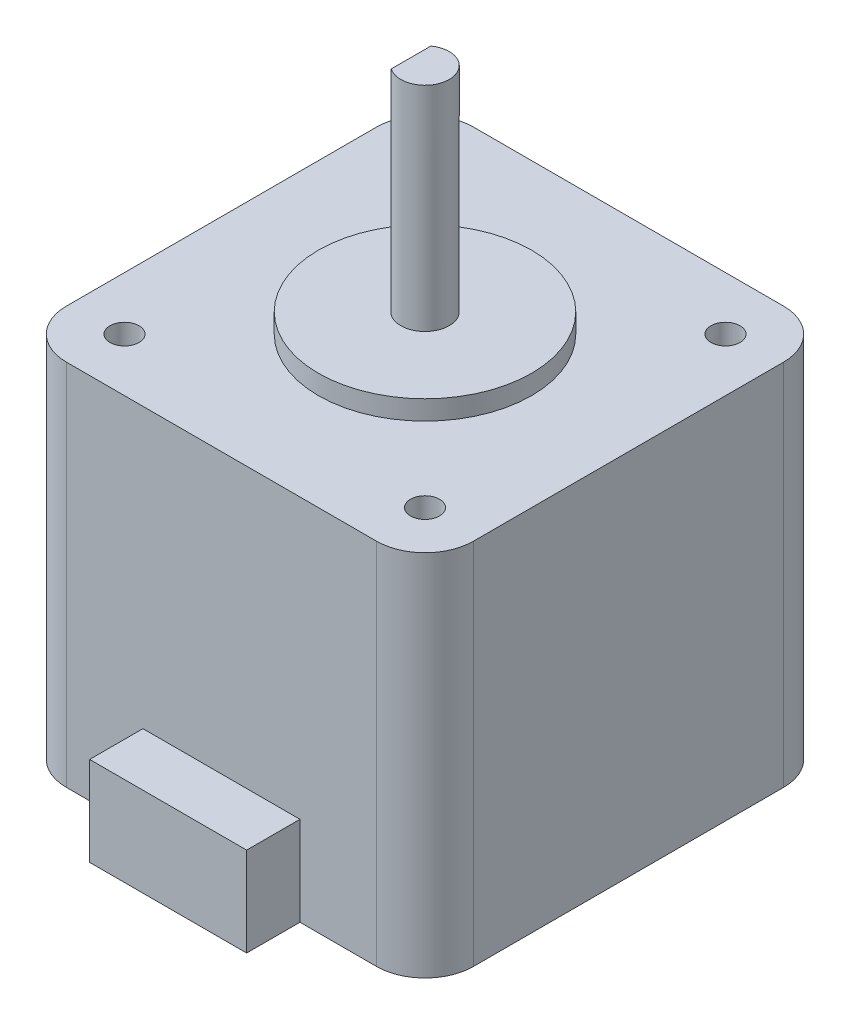
ISO-10303-21;
HEADER;
FILE_DESCRIPTION(('STEP AP214'),'2;1');
FILE_NAME('part.step','',(''),(''),'','','');
FILE_SCHEMA(('AUTOMOTIVE_DESIGN { 1 0 10303 214 1 1 1 1 }'));
ENDSEC;
DATA;
#1=APPLICATION_CONTEXT('core data for automotive mechanical design processes');
#2=APPLICATION_PROTOCOL_DEFINITION('international standard','automotive_design',2000,#1);
#3=PRODUCT_CONTEXT('',#1,'mechanical');
#4=PRODUCT('Part','Part','',(#3));
#5=PRODUCT_RELATED_PRODUCT_CATEGORY('part','',(#4));
#6=PRODUCT_DEFINITION_FORMATION('','',#4);
#7=PRODUCT_DEFINITION_CONTEXT('part definition',#1,'design');
#8=PRODUCT_DEFINITION('design','',#6,#7);
#9=PRODUCT_DEFINITION_SHAPE('','',#8);
#10=(LENGTH_UNIT() NAMED_UNIT(*) SI_UNIT(.MILLI.,.METRE.));
#11=(NAMED_UNIT(*) PLANE_ANGLE_UNIT() SI_UNIT($,.RADIAN.));
#12=(NAMED_UNIT(*) SI_UNIT($,.STERADIAN.) SOLID_ANGLE_UNIT());
#13=UNCERTAINTY_MEASURE_WITH_UNIT(LENGTH_MEASURE(1.E-05),#10,'distance_accuracy_value','');
#14=(GEOMETRIC_REPRESENTATION_CONTEXT(3) GLOBAL_UNCERTAINTY_ASSIGNED_CONTEXT((#13)) GLOBAL_UNIT_ASSIGNED_CONTEXT((#10,
#11,#12)) REPRESENTATION_CONTEXT('',''));
#15=CARTESIAN_POINT('',(0.,0.,0.));
#16=DIRECTION('',(0.,0.,1.));
#17=DIRECTION('',(1.,0.,0.));
#18=AXIS2_PLACEMENT_3D('',#15,#16,#17);
#19=CARTESIAN_POINT('',(0.,62.,0.));
#20=DIRECTION('',(0.,-1.,0.));
#21=DIRECTION('',(0.,0.,-1.));
#22=AXIS2_PLACEMENT_3D('',#19,#20,#21);
#23=CYLINDRICAL_SURFACE('',#22,2.5);
#24=CARTESIAN_POINT('',(0.,40.,0.));
#25=DIRECTION('',(0.,1.,0.));
#26=DIRECTION('',(0.,0.,1.));
#27=AXIS2_PLACEMENT_3D('',#24,#25,#26);
#28=CIRCLE('',#27,2.5);
#29=CARTESIAN_POINT('',(0.,40.,2.5));
#30=VERTEX_POINT('',#29);
#31=EDGE_CURVE('E249',#30,#30,#28,.T.);
#32=ORIENTED_EDGE('',*,*,#31,.T.);
#33=EDGE_LOOP('',(#32));
#34=FACE_BOUND('',#33,.T.);
#35=DIRECTION('',(0.,1.,0.));
#36=VECTOR('',#35,1.);
#37=CARTESIAN_POINT('',(-1.4382470003859,42.,-2.04485832415866));
#38=LINE('',#37,#36);
#39=CARTESIAN_POINT('',(-1.4382470003859,42.,-2.04485832415866));
#40=VERTEX_POINT('',#39);
#41=CARTESIAN_POINT('',(-1.4382470003859,62.,-2.04485832415866));
#42=VERTEX_POINT('',#41);
#43=EDGE_CURVE('E140',#40,#42,#38,.T.);
#44=ORIENTED_EDGE('',*,*,#43,.T.);
#45=CARTESIAN_POINT('',(0.,62.,0.));
#46=DIRECTION('',(0.,1.,0.));
#47=DIRECTION('',(0.,0.,1.));
#48=AXIS2_PLACEMENT_3D('',#45,#46,#47);
#49=CIRCLE('',#48,2.5);
#50=CARTESIAN_POINT('',(-1.4382470003859,62.,2.04485832415866));
#51=VERTEX_POINT('',#50);
#52=EDGE_CURVE('E245',#51,#42,#49,.T.);
#53=ORIENTED_EDGE('',*,*,#52,.F.);
#54=DIRECTION('',(0.,1.,0.));
#55=VECTOR('',#54,1.);
#56=CARTESIAN_POINT('',(-1.4382470003859,42.,2.04485832415866));
#57=LINE('',#56,#55);
#58=CARTESIAN_POINT('',(-1.4382470003859,42.,2.04485832415866));
#59=VERTEX_POINT('',#58);
#60=EDGE_CURVE('E56',#59,#51,#57,.T.);
#61=ORIENTED_EDGE('',*,*,#60,.F.);
#62=CARTESIAN_POINT('',(0.,42.,0.));
#63=DIRECTION('',(0.,1.,0.));
#64=DIRECTION('',(0.,0.,1.));
#65=AXIS2_PLACEMENT_3D('',#62,#63,#64);
#66=CIRCLE('',#65,2.5);
#67=EDGE_CURVE('E151',#40,#59,#66,.T.);
#68=ORIENTED_EDGE('',*,*,#67,.F.);
#69=EDGE_LOOP('',(#44,#53,#61,#68));
#70=FACE_BOUND('',#69,.T.);
#71=ADVANCED_FACE('F40',(#34,#70),#23,.T.);
#72=CARTESIAN_POINT('',(0.,62.,0.));
#73=DIRECTION('',(0.,1.,0.));
#74=DIRECTION('',(0.,0.,1.));
#75=AXIS2_PLACEMENT_3D('',#72,#73,#74);
#76=PLANE('',#75);
#77=ORIENTED_EDGE('',*,*,#52,.T.);
#78=DIRECTION('',(0.,0.,1.));
#79=VECTOR('',#78,1.);
#80=CARTESIAN_POINT('',(-1.4382470003859,62.,0.));
#81=LINE('',#80,#79);
#82=EDGE_CURVE('E145',#42,#51,#81,.T.);
#83=ORIENTED_EDGE('',*,*,#82,.T.);
#84=EDGE_LOOP('',(#77,#83));
#85=FACE_BOUND('',#84,.T.);
#86=ADVANCED_FACE('F398',(#85),#76,.T.);
#87=CARTESIAN_POINT('',(-21.,38.,21.));
#88=DIRECTION('',(0.,0.,-1.));
#89=DIRECTION('',(-1.,0.,0.));
#90=AXIS2_PLACEMENT_3D('',#87,#88,#89);
#91=PLANE('',#90);
#92=DIRECTION('',(1.,0.,0.));
#93=VECTOR('',#92,1.);
#94=CARTESIAN_POINT('',(-21.,0.,21.));
#95=LINE('',#94,#93);
#96=CARTESIAN_POINT('',(8.1,0.,21.));
#97=VERTEX_POINT('',#96);
#98=CARTESIAN_POINT('',(16.,0.,21.));
#99=VERTEX_POINT('',#98);
#100=EDGE_CURVE('E289',#97,#99,#95,.T.);
#101=ORIENTED_EDGE('',*,*,#100,.T.);
#102=DIRECTION('',(0.,-1.,0.));
#103=VECTOR('',#102,1.);
#104=CARTESIAN_POINT('',(16.,38.,21.));
#105=LINE('',#104,#103);
#106=CARTESIAN_POINT('',(16.,38.,21.));
#107=VERTEX_POINT('',#106);
#108=EDGE_CURVE('E11',#99,#107,#105,.F.);
#109=ORIENTED_EDGE('',*,*,#108,.T.);
#110=DIRECTION('',(1.,0.,0.));
#111=VECTOR('',#110,1.);
#112=CARTESIAN_POINT('',(-21.,38.,21.));
#113=LINE('',#112,#111);
#114=CARTESIAN_POINT('',(-16.,38.,21.));
#115=VERTEX_POINT('',#114);
#116=EDGE_CURVE('E262',#115,#107,#113,.T.);
#117=ORIENTED_EDGE('',*,*,#116,.F.);
#118=DIRECTION('',(0.,-1.,0.));
#119=VECTOR('',#118,1.);
#120=CARTESIAN_POINT('',(-16.,38.,21.));
#121=LINE('',#120,#119);
#122=CARTESIAN_POINT('',(-16.,0.,21.));
#123=VERTEX_POINT('',#122);
#124=EDGE_CURVE('E49',#115,#123,#121,.T.);
#125=ORIENTED_EDGE('',*,*,#124,.T.);
#126=CARTESIAN_POINT('',(-8.1,0.,21.));
#127=VERTEX_POINT('',#126);
#128=EDGE_CURVE('E268',#123,#127,#95,.T.);
#129=ORIENTED_EDGE('',*,*,#128,.T.);
#130=DIRECTION('',(0.,-1.,0.));
#131=VECTOR('',#130,1.);
#132=CARTESIAN_POINT('',(-8.1,9.2,21.));
#133=LINE('',#132,#131);
#134=CARTESIAN_POINT('',(-8.1,9.2,21.));
#135=VERTEX_POINT('',#134);
#136=EDGE_CURVE('E210',#135,#127,#133,.T.);
#137=ORIENTED_EDGE('',*,*,#136,.F.);
#138=DIRECTION('',(-1.,0.,0.));
#139=VECTOR('',#138,1.);
#140=CARTESIAN_POINT('',(-8.1,9.2,21.));
#141=LINE('',#140,#139);
#142=CARTESIAN_POINT('',(8.1,9.2,21.));
#143=VERTEX_POINT('',#142);
#144=EDGE_CURVE('E223',#143,#135,#141,.T.);
#145=ORIENTED_EDGE('',*,*,#144,.F.);
#146=DIRECTION('',(0.,1.,0.));
#147=VECTOR('',#146,1.);
#148=CARTESIAN_POINT('',(8.1,9.2,21.));
#149=LINE('',#148,#147);
#150=EDGE_CURVE('E201',#97,#143,#149,.T.);
#151=ORIENTED_EDGE('',*,*,#150,.F.);
#152=EDGE_LOOP('',(#101,#109,#117,#125,#129,#137,#145,#151));
#153=FACE_BOUND('',#152,.T.);
#154=ADVANCED_FACE('F339',(#153),#91,.F.);
#155=CARTESIAN_POINT('',(21.,38.,-21.));
#156=DIRECTION('',(-1.,0.,0.));
#157=DIRECTION('',(0.,0.,1.));
#158=AXIS2_PLACEMENT_3D('',#155,#156,#157);
#159=PLANE('',#158);
#160=DIRECTION('',(0.,0.,-1.));
#161=VECTOR('',#160,1.);
#162=CARTESIAN_POINT('',(21.,0.,-21.));
#163=LINE('',#162,#161);
#164=CARTESIAN_POINT('',(21.,0.,16.));
#165=VERTEX_POINT('',#164);
#166=CARTESIAN_POINT('',(21.,0.,-16.));
#167=VERTEX_POINT('',#166);
#168=EDGE_CURVE('E258',#165,#167,#163,.T.);
#169=ORIENTED_EDGE('',*,*,#168,.T.);
#170=DIRECTION('',(0.,-1.,0.));
#171=VECTOR('',#170,1.);
#172=CARTESIAN_POINT('',(21.,38.,-16.));
#173=LINE('',#172,#171);
#174=CARTESIAN_POINT('',(21.,38.,-16.));
#175=VERTEX_POINT('',#174);
#176=EDGE_CURVE('E314',#167,#175,#173,.F.);
#177=ORIENTED_EDGE('',*,*,#176,.T.);
#178=DIRECTION('',(0.,0.,-1.));
#179=VECTOR('',#178,1.);
#180=CARTESIAN_POINT('',(21.,38.,-21.));
#181=LINE('',#180,#179);
#182=CARTESIAN_POINT('',(21.,38.,16.));
#183=VERTEX_POINT('',#182);
#184=EDGE_CURVE('E263',#183,#175,#181,.T.);
#185=ORIENTED_EDGE('',*,*,#184,.F.);
#186=DIRECTION('',(0.,-1.,0.));
#187=VECTOR('',#186,1.);
#188=CARTESIAN_POINT('',(21.,38.,16.));
#189=LINE('',#188,#187);
#190=EDGE_CURVE('E310',#183,#165,#189,.T.);
#191=ORIENTED_EDGE('',*,*,#190,.T.);
#192=EDGE_LOOP('',(#169,#177,#185,#191));
#193=FACE_BOUND('',#192,.T.);
#194=ADVANCED_FACE('F368',(#193),#159,.F.);
#195=CARTESIAN_POINT('',(-21.,38.,-21.));
#196=DIRECTION('',(0.,0.,1.));
#197=DIRECTION('',(1.,0.,0.));
#198=AXIS2_PLACEMENT_3D('',#195,#196,#197);
#199=PLANE('',#198);
#200=DIRECTION('',(-1.,0.,0.));
#201=VECTOR('',#200,1.);
#202=CARTESIAN_POINT('',(-21.,38.,-21.));
#203=LINE('',#202,#201);
#204=CARTESIAN_POINT('',(16.,38.,-21.));
#205=VERTEX_POINT('',#204);
#206=CARTESIAN_POINT('',(-16.,38.,-21.));
#207=VERTEX_POINT('',#206);
#208=EDGE_CURVE('E267',#205,#207,#203,.T.);
#209=ORIENTED_EDGE('',*,*,#208,.F.);
#210=DIRECTION('',(0.,-1.,0.));
#211=VECTOR('',#210,1.);
#212=CARTESIAN_POINT('',(16.,38.,-21.));
#213=LINE('',#212,#211);
#214=CARTESIAN_POINT('',(16.,0.,-21.));
#215=VERTEX_POINT('',#214);
#216=EDGE_CURVE('E294',#205,#215,#213,.T.);
#217=ORIENTED_EDGE('',*,*,#216,.T.);
#218=DIRECTION('',(-1.,0.,0.));
#219=VECTOR('',#218,1.);
#220=CARTESIAN_POINT('',(-21.,0.,-21.));
#221=LINE('',#220,#219);
#222=CARTESIAN_POINT('',(-16.,0.,-21.));
#223=VERTEX_POINT('',#222);
#224=EDGE_CURVE('E281',#215,#223,#221,.T.);
#225=ORIENTED_EDGE('',*,*,#224,.T.);
#226=DIRECTION('',(0.,-1.,0.));
#227=VECTOR('',#226,1.);
#228=CARTESIAN_POINT('',(-16.,38.,-21.));
#229=LINE('',#228,#227);
#230=EDGE_CURVE('E253',#223,#207,#229,.F.);
#231=ORIENTED_EDGE('',*,*,#230,.T.);
#232=EDGE_LOOP('',(#209,#217,#225,#231));
#233=FACE_BOUND('',#232,.T.);
#234=ADVANCED_FACE('F378',(#233),#199,.F.);
#235=CARTESIAN_POINT('',(-21.,38.,-21.));
#236=DIRECTION('',(1.,0.,0.));
#237=DIRECTION('',(0.,0.,-1.));
#238=AXIS2_PLACEMENT_3D('',#235,#236,#237);
#239=PLANE('',#238);
#240=DIRECTION('',(0.,0.,1.));
#241=VECTOR('',#240,1.);
#242=CARTESIAN_POINT('',(-21.,38.,-21.));
#243=LINE('',#242,#241);
#244=CARTESIAN_POINT('',(-21.,38.,-16.));
#245=VERTEX_POINT('',#244);
#246=CARTESIAN_POINT('',(-21.,38.,16.));
#247=VERTEX_POINT('',#246);
#248=EDGE_CURVE('E272',#245,#247,#243,.T.);
#249=ORIENTED_EDGE('',*,*,#248,.F.);
#250=DIRECTION('',(0.,-1.,0.));
#251=VECTOR('',#250,1.);
#252=CARTESIAN_POINT('',(-21.,38.,-16.));
#253=LINE('',#252,#251);
#254=CARTESIAN_POINT('',(-21.,0.,-16.));
#255=VERTEX_POINT('',#254);
#256=EDGE_CURVE('E332',#245,#255,#253,.T.);
#257=ORIENTED_EDGE('',*,*,#256,.T.);
#258=DIRECTION('',(0.,0.,1.));
#259=VECTOR('',#258,1.);
#260=CARTESIAN_POINT('',(-21.,0.,-21.));
#261=LINE('',#260,#259);
#262=CARTESIAN_POINT('',(-21.,0.,16.));
#263=VERTEX_POINT('',#262);
#264=EDGE_CURVE('E285',#255,#263,#261,.T.);
#265=ORIENTED_EDGE('',*,*,#264,.T.);
#266=DIRECTION('',(0.,-1.,0.));
#267=VECTOR('',#266,1.);
#268=CARTESIAN_POINT('',(-21.,38.,16.));
#269=LINE('',#268,#267);
#270=EDGE_CURVE('E329',#263,#247,#269,.F.);
#271=ORIENTED_EDGE('',*,*,#270,.T.);
#272=EDGE_LOOP('',(#249,#257,#265,#271));
#273=FACE_BOUND('',#272,.T.);
#274=ADVANCED_FACE('F386',(#273),#239,.F.);
#275=CARTESIAN_POINT('',(0.,38.,0.));
#276=DIRECTION('',(0.,1.,0.));
#277=DIRECTION('',(0.,0.,1.));
#278=AXIS2_PLACEMENT_3D('',#275,#276,#277);
#279=PLANE('',#278);
#280=CARTESIAN_POINT('',(-15.4999999999991,38.,15.5));
#281=DIRECTION('',(0.,1.,0.));
#282=DIRECTION('',(0.,0.,1.));
#283=AXIS2_PLACEMENT_3D('',#280,#281,#282);
#284=CIRCLE('',#283,1.50000000000046);
#285=CARTESIAN_POINT('',(-15.4999999999991,38.,17.0000000000005));
#286=VERTEX_POINT('',#285);
#287=EDGE_CURVE('E169',#286,#286,#284,.T.);
#288=ORIENTED_EDGE('',*,*,#287,.F.);
#289=EDGE_LOOP('',(#288));
#290=FACE_BOUND('',#289,.T.);
#291=CARTESIAN_POINT('',(15.5000000000009,38.,15.4999999999991));
#292=DIRECTION('',(0.,1.,0.));
#293=DIRECTION('',(0.,0.,1.));
#294=AXIS2_PLACEMENT_3D('',#291,#292,#293);
#295=CIRCLE('',#294,1.50000000000121);
#296=CARTESIAN_POINT('',(15.5000000000009,38.,17.0000000000003));
#297=VERTEX_POINT('',#296);
#298=EDGE_CURVE('E186',#297,#297,#295,.T.);
#299=ORIENTED_EDGE('',*,*,#298,.F.);
#300=EDGE_LOOP('',(#299));
#301=FACE_BOUND('',#300,.T.);
#302=CARTESIAN_POINT('',(15.5,38.,-15.5000000000009));
#303=DIRECTION('',(0.,1.,0.));
#304=DIRECTION('',(0.,0.,1.));
#305=AXIS2_PLACEMENT_3D('',#302,#303,#304);
#306=CIRCLE('',#305,1.5000000000009);
#307=CARTESIAN_POINT('',(15.5,38.,-14.));
#308=VERTEX_POINT('',#307);
#309=EDGE_CURVE('E178',#308,#308,#306,.T.);
#310=ORIENTED_EDGE('',*,*,#309,.F.);
#311=EDGE_LOOP('',(#310));
#312=FACE_BOUND('',#311,.T.);
#313=CARTESIAN_POINT('',(-15.5,38.,-15.5));
#314=DIRECTION('',(0.,1.,0.));
#315=DIRECTION('',(0.,0.,1.));
#316=AXIS2_PLACEMENT_3D('',#313,#314,#315);
#317=CIRCLE('',#316,1.5);
#318=CARTESIAN_POINT('',(-15.5,38.,-14.));
#319=VERTEX_POINT('',#318);
#320=EDGE_CURVE('E177',#319,#319,#317,.T.);
#321=ORIENTED_EDGE('',*,*,#320,.F.);
#322=EDGE_LOOP('',(#321));
#323=FACE_BOUND('',#322,.T.);
#324=CARTESIAN_POINT('',(0.,38.,0.));
#325=DIRECTION('',(0.,1.,0.));
#326=DIRECTION('',(0.,0.,1.));
#327=AXIS2_PLACEMENT_3D('',#324,#325,#326);
#328=CIRCLE('',#327,11.);
#329=CARTESIAN_POINT('',(0.,38.,11.));
#330=VERTEX_POINT('',#329);
#331=EDGE_CURVE('E254',#330,#330,#328,.T.);
#332=ORIENTED_EDGE('',*,*,#331,.F.);
#333=EDGE_LOOP('',(#332));
#334=FACE_BOUND('',#333,.T.);
#335=ORIENTED_EDGE('',*,*,#184,.T.);
#336=CARTESIAN_POINT('',(16.,38.,-16.));
#337=DIRECTION('',(0.,1.,0.));
#338=DIRECTION('',(0.,0.,1.));
#339=AXIS2_PLACEMENT_3D('',#336,#337,#338);
#340=CIRCLE('',#339,5.);
#341=EDGE_CURVE('E326',#175,#205,#340,.T.);
#342=ORIENTED_EDGE('',*,*,#341,.T.);
#343=ORIENTED_EDGE('',*,*,#208,.T.);
#344=CARTESIAN_POINT('',(-16.,38.,-16.));
#345=DIRECTION('',(0.,1.,0.));
#346=DIRECTION('',(0.,0.,1.));
#347=AXIS2_PLACEMENT_3D('',#344,#345,#346);
#348=CIRCLE('',#347,5.);
#349=EDGE_CURVE('E323',#207,#245,#348,.T.);
#350=ORIENTED_EDGE('',*,*,#349,.T.);
#351=ORIENTED_EDGE('',*,*,#248,.T.);
#352=CARTESIAN_POINT('',(-16.,38.,16.));
#353=DIRECTION('',(0.,1.,0.));
#354=DIRECTION('',(0.,0.,1.));
#355=AXIS2_PLACEMENT_3D('',#352,#353,#354);
#356=CIRCLE('',#355,5.);
#357=EDGE_CURVE('E317',#247,#115,#356,.T.);
#358=ORIENTED_EDGE('',*,*,#357,.T.);
#359=ORIENTED_EDGE('',*,*,#116,.T.);
#360=CARTESIAN_POINT('',(16.,38.,16.));
#361=DIRECTION('',(0.,1.,0.));
#362=DIRECTION('',(0.,0.,1.));
#363=AXIS2_PLACEMENT_3D('',#360,#361,#362);
#364=CIRCLE('',#363,5.);
#365=EDGE_CURVE('E320',#107,#183,#364,.T.);
#366=ORIENTED_EDGE('',*,*,#365,.T.);
#367=EDGE_LOOP('',(#335,#342,#343,#350,#351,#358,#359,#366));
#368=FACE_BOUND('',#367,.T.);
#369=ADVANCED_FACE('F372',(#290,#301,#312,#323,#334,#368),#279,.T.);
#370=CARTESIAN_POINT('',(0.,0.,0.));
#371=DIRECTION('',(0.,1.,0.));
#372=DIRECTION('',(0.,0.,1.));
#373=AXIS2_PLACEMENT_3D('',#370,#371,#372);
#374=PLANE('',#373);
#375=CARTESIAN_POINT('',(0.,0.,0.));
#376=DIRECTION('',(0.,-1.,0.));
#377=DIRECTION('',(0.,0.,-1.));
#378=AXIS2_PLACEMENT_3D('',#375,#376,#377);
#379=CIRCLE('',#378,4.);
#380=CARTESIAN_POINT('',(0.,0.,-4.));
#381=VERTEX_POINT('',#380);
#382=EDGE_CURVE('E163',#381,#381,#379,.T.);
#383=ORIENTED_EDGE('',*,*,#382,.F.);
#384=EDGE_LOOP('',(#383));
#385=FACE_BOUND('',#384,.T.);
#386=ORIENTED_EDGE('',*,*,#224,.F.);
#387=CARTESIAN_POINT('',(16.,0.,-16.));
#388=DIRECTION('',(0.,1.,0.));
#389=DIRECTION('',(0.,0.,1.));
#390=AXIS2_PLACEMENT_3D('',#387,#388,#389);
#391=CIRCLE('',#390,5.);
#392=EDGE_CURVE('E307',#215,#167,#391,.F.);
#393=ORIENTED_EDGE('',*,*,#392,.T.);
#394=ORIENTED_EDGE('',*,*,#168,.F.);
#395=CARTESIAN_POINT('',(16.,0.,16.));
#396=DIRECTION('',(0.,1.,0.));
#397=DIRECTION('',(0.,0.,1.));
#398=AXIS2_PLACEMENT_3D('',#395,#396,#397);
#399=CIRCLE('',#398,5.);
#400=EDGE_CURVE('E301',#165,#99,#399,.F.);
#401=ORIENTED_EDGE('',*,*,#400,.T.);
#402=ORIENTED_EDGE('',*,*,#100,.F.);
#403=DIRECTION('',(0.,0.,-1.));
#404=VECTOR('',#403,1.);
#405=CARTESIAN_POINT('',(8.1,0.,26.5));
#406=LINE('',#405,#404);
#407=CARTESIAN_POINT('',(8.1,0.,26.5));
#408=VERTEX_POINT('',#407);
#409=EDGE_CURVE('E219',#408,#97,#406,.T.);
#410=ORIENTED_EDGE('',*,*,#409,.F.);
#411=DIRECTION('',(1.,0.,0.));
#412=VECTOR('',#411,1.);
#413=CARTESIAN_POINT('',(-8.1,0.,26.5));
#414=LINE('',#413,#412);
#415=CARTESIAN_POINT('',(-8.1,0.,26.5));
#416=VERTEX_POINT('',#415);
#417=EDGE_CURVE('E216',#416,#408,#414,.T.);
#418=ORIENTED_EDGE('',*,*,#417,.F.);
#419=DIRECTION('',(0.,0.,-1.));
#420=VECTOR('',#419,1.);
#421=CARTESIAN_POINT('',(-8.1,0.,26.5));
#422=LINE('',#421,#420);
#423=EDGE_CURVE('E233',#416,#127,#422,.T.);
#424=ORIENTED_EDGE('',*,*,#423,.T.);
#425=ORIENTED_EDGE('',*,*,#128,.F.);
#426=CARTESIAN_POINT('',(-16.,0.,16.));
#427=DIRECTION('',(0.,1.,0.));
#428=DIRECTION('',(0.,0.,1.));
#429=AXIS2_PLACEMENT_3D('',#426,#427,#428);
#430=CIRCLE('',#429,5.);
#431=EDGE_CURVE('E298',#123,#263,#430,.F.);
#432=ORIENTED_EDGE('',*,*,#431,.T.);
#433=ORIENTED_EDGE('',*,*,#264,.F.);
#434=CARTESIAN_POINT('',(-16.,0.,-16.));
#435=DIRECTION('',(0.,1.,0.));
#436=DIRECTION('',(0.,0.,1.));
#437=AXIS2_PLACEMENT_3D('',#434,#435,#436);
#438=CIRCLE('',#437,5.);
#439=EDGE_CURVE('E304',#255,#223,#438,.F.);
#440=ORIENTED_EDGE('',*,*,#439,.T.);
#441=EDGE_LOOP('',(#386,#393,#394,#401,#402,#410,#418,#424,#425,#432,#433,#440));
#442=FACE_BOUND('',#441,.T.);
#443=ADVANCED_FACE('F344',(#385,#442),#374,.F.);
#444=CARTESIAN_POINT('',(0.,40.,0.));
#445=DIRECTION('',(0.,-1.,0.));
#446=DIRECTION('',(0.,0.,-1.));
#447=AXIS2_PLACEMENT_3D('',#444,#445,#446);
#448=CYLINDRICAL_SURFACE('',#447,11.);
#449=CARTESIAN_POINT('',(0.,40.,0.));
#450=DIRECTION('',(0.,1.,0.));
#451=DIRECTION('',(0.,0.,1.));
#452=AXIS2_PLACEMENT_3D('',#449,#450,#451);
#453=CIRCLE('',#452,11.);
#454=CARTESIAN_POINT('',(0.,40.,11.));
#455=VERTEX_POINT('',#454);
#456=EDGE_CURVE('E248',#455,#455,#453,.T.);
#457=ORIENTED_EDGE('',*,*,#456,.F.);
#458=EDGE_LOOP('',(#457));
#459=FACE_BOUND('',#458,.T.);
#460=ORIENTED_EDGE('',*,*,#331,.T.);
#461=EDGE_LOOP('',(#460));
#462=FACE_BOUND('',#461,.T.);
#463=ADVANCED_FACE('F412',(#459,#462),#448,.T.);
#464=CARTESIAN_POINT('',(0.,40.,0.));
#465=DIRECTION('',(0.,1.,0.));
#466=DIRECTION('',(0.,0.,1.));
#467=AXIS2_PLACEMENT_3D('',#464,#465,#466);
#468=PLANE('',#467);
#469=ORIENTED_EDGE('',*,*,#31,.F.);
#470=EDGE_LOOP('',(#469));
#471=FACE_BOUND('',#470,.T.);
#472=ORIENTED_EDGE('',*,*,#456,.T.);
#473=EDGE_LOOP('',(#472));
#474=FACE_BOUND('',#473,.T.);
#475=ADVANCED_FACE('F409',(#471,#474),#468,.T.);
#476=CARTESIAN_POINT('',(8.1,9.2,26.5));
#477=DIRECTION('',(-1.,0.,0.));
#478=DIRECTION('',(0.,0.,1.));
#479=AXIS2_PLACEMENT_3D('',#476,#477,#478);
#480=PLANE('',#479);
#481=ORIENTED_EDGE('',*,*,#150,.T.);
#482=DIRECTION('',(0.,0.,-1.));
#483=VECTOR('',#482,1.);
#484=CARTESIAN_POINT('',(8.1,9.2,26.5));
#485=LINE('',#484,#483);
#486=CARTESIAN_POINT('',(8.1,9.2,26.5));
#487=VERTEX_POINT('',#486);
#488=EDGE_CURVE('E241',#487,#143,#485,.T.);
#489=ORIENTED_EDGE('',*,*,#488,.F.);
#490=DIRECTION('',(0.,1.,0.));
#491=VECTOR('',#490,1.);
#492=CARTESIAN_POINT('',(8.1,9.2,26.5));
#493=LINE('',#492,#491);
#494=EDGE_CURVE('E205',#408,#487,#493,.T.);
#495=ORIENTED_EDGE('',*,*,#494,.F.);
#496=ORIENTED_EDGE('',*,*,#409,.T.);
#497=EDGE_LOOP('',(#481,#489,#495,#496));
#498=FACE_BOUND('',#497,.T.);
#499=ADVANCED_FACE('F358',(#498),#480,.F.);
#500=CARTESIAN_POINT('',(-8.1,9.2,26.5));
#501=DIRECTION('',(0.,-1.,0.));
#502=DIRECTION('',(0.,0.,-1.));
#503=AXIS2_PLACEMENT_3D('',#500,#501,#502);
#504=PLANE('',#503);
#505=ORIENTED_EDGE('',*,*,#144,.T.);
#506=DIRECTION('',(0.,0.,-1.));
#507=VECTOR('',#506,1.);
#508=CARTESIAN_POINT('',(-8.1,9.2,26.5));
#509=LINE('',#508,#507);
#510=CARTESIAN_POINT('',(-8.1,9.2,26.5));
#511=VERTEX_POINT('',#510);
#512=EDGE_CURVE('E237',#511,#135,#509,.T.);
#513=ORIENTED_EDGE('',*,*,#512,.F.);
#514=DIRECTION('',(-1.,0.,0.));
#515=VECTOR('',#514,1.);
#516=CARTESIAN_POINT('',(-8.1,9.2,26.5));
#517=LINE('',#516,#515);
#518=EDGE_CURVE('E209',#487,#511,#517,.T.);
#519=ORIENTED_EDGE('',*,*,#518,.F.);
#520=ORIENTED_EDGE('',*,*,#488,.T.);
#521=EDGE_LOOP('',(#505,#513,#519,#520));
#522=FACE_BOUND('',#521,.T.);
#523=ADVANCED_FACE('F354',(#522),#504,.F.);
#524=CARTESIAN_POINT('',(-8.1,9.2,26.5));
#525=DIRECTION('',(1.,0.,0.));
#526=DIRECTION('',(0.,1.,0.));
#527=AXIS2_PLACEMENT_3D('',#524,#525,#526);
#528=PLANE('',#527);
#529=ORIENTED_EDGE('',*,*,#136,.T.);
#530=ORIENTED_EDGE('',*,*,#423,.F.);
#531=DIRECTION('',(0.,-1.,0.));
#532=VECTOR('',#531,1.);
#533=CARTESIAN_POINT('',(-8.1,9.2,26.5));
#534=LINE('',#533,#532);
#535=EDGE_CURVE('E213',#511,#416,#534,.T.);
#536=ORIENTED_EDGE('',*,*,#535,.F.);
#537=ORIENTED_EDGE('',*,*,#512,.T.);
#538=EDGE_LOOP('',(#529,#530,#536,#537));
#539=FACE_BOUND('',#538,.T.);
#540=ADVANCED_FACE('F351',(#539),#528,.F.);
#541=CARTESIAN_POINT('',(0.,0.,26.5));
#542=DIRECTION('',(0.,0.,1.));
#543=DIRECTION('',(1.,0.,0.));
#544=AXIS2_PLACEMENT_3D('',#541,#542,#543);
#545=PLANE('',#544);
#546=ORIENTED_EDGE('',*,*,#494,.T.);
#547=ORIENTED_EDGE('',*,*,#518,.T.);
#548=ORIENTED_EDGE('',*,*,#535,.T.);
#549=ORIENTED_EDGE('',*,*,#417,.T.);
#550=EDGE_LOOP('',(#546,#547,#548,#549));
#551=FACE_BOUND('',#550,.T.);
#552=ADVANCED_FACE('F535',(#551),#545,.T.);
#553=CARTESIAN_POINT('',(-15.5,33.,-15.5));
#554=DIRECTION('',(0.,1.,0.));
#555=DIRECTION('',(0.,0.,1.));
#556=AXIS2_PLACEMENT_3D('',#553,#554,#555);
#557=CYLINDRICAL_SURFACE('',#556,1.5);
#558=CARTESIAN_POINT('',(-15.5,33.,-15.5));
#559=DIRECTION('',(0.,1.,0.));
#560=DIRECTION('',(0.,0.,1.));
#561=AXIS2_PLACEMENT_3D('',#558,#559,#560);
#562=CIRCLE('',#561,1.5);
#563=CARTESIAN_POINT('',(-15.5,33.,-14.));
#564=VERTEX_POINT('',#563);
#565=EDGE_CURVE('E197',#564,#564,#562,.T.);
#566=ORIENTED_EDGE('',*,*,#565,.F.);
#567=EDGE_LOOP('',(#566));
#568=FACE_BOUND('',#567,.T.);
#569=ORIENTED_EDGE('',*,*,#320,.T.);
#570=EDGE_LOOP('',(#569));
#571=FACE_BOUND('',#570,.T.);
#572=ADVANCED_FACE('F544',(#568,#571),#557,.F.);
#573=CARTESIAN_POINT('',(-15.5,33.,-15.5));
#574=DIRECTION('',(0.,1.,0.));
#575=DIRECTION('',(0.,0.,1.));
#576=AXIS2_PLACEMENT_3D('',#573,#574,#575);
#577=PLANE('',#576);
#578=ORIENTED_EDGE('',*,*,#565,.T.);
#579=EDGE_LOOP('',(#578));
#580=FACE_BOUND('',#579,.T.);
#581=ADVANCED_FACE('F554',(#580),#577,.T.);
#582=CARTESIAN_POINT('',(15.5,33.,-15.5000000000009));
#583=DIRECTION('',(0.,1.,0.));
#584=DIRECTION('',(0.,0.,1.));
#585=AXIS2_PLACEMENT_3D('',#582,#583,#584);
#586=CYLINDRICAL_SURFACE('',#585,1.5000000000009);
#587=CARTESIAN_POINT('',(15.5,33.,-15.5000000000009));
#588=DIRECTION('',(0.,1.,0.));
#589=DIRECTION('',(0.,0.,1.));
#590=AXIS2_PLACEMENT_3D('',#587,#588,#589);
#591=CIRCLE('',#590,1.5000000000009);
#592=CARTESIAN_POINT('',(15.5,33.,-14.));
#593=VERTEX_POINT('',#592);
#594=EDGE_CURVE('E173',#593,#593,#591,.T.);
#595=ORIENTED_EDGE('',*,*,#594,.F.);
#596=EDGE_LOOP('',(#595));
#597=FACE_BOUND('',#596,.T.);
#598=ORIENTED_EDGE('',*,*,#309,.T.);
#599=EDGE_LOOP('',(#598));
#600=FACE_BOUND('',#599,.T.);
#601=ADVANCED_FACE('F564',(#597,#600),#586,.F.);
#602=CARTESIAN_POINT('',(15.5,33.,-15.5000000000009));
#603=DIRECTION('',(0.,1.,0.));
#604=DIRECTION('',(0.,0.,1.));
#605=AXIS2_PLACEMENT_3D('',#602,#603,#604);
#606=PLANE('',#605);
#607=ORIENTED_EDGE('',*,*,#594,.T.);
#608=EDGE_LOOP('',(#607));
#609=FACE_BOUND('',#608,.T.);
#610=ADVANCED_FACE('F574',(#609),#606,.T.);
#611=CARTESIAN_POINT('',(15.5000000000009,33.,15.4999999999991));
#612=DIRECTION('',(0.,1.,0.));
#613=DIRECTION('',(0.,0.,1.));
#614=AXIS2_PLACEMENT_3D('',#611,#612,#613);
#615=CYLINDRICAL_SURFACE('',#614,1.50000000000121);
#616=CARTESIAN_POINT('',(15.5000000000009,33.,15.4999999999991));
#617=DIRECTION('',(0.,1.,0.));
#618=DIRECTION('',(0.,0.,1.));
#619=AXIS2_PLACEMENT_3D('',#616,#617,#618);
#620=CIRCLE('',#619,1.50000000000121);
#621=CARTESIAN_POINT('',(15.5000000000009,33.,17.0000000000003));
#622=VERTEX_POINT('',#621);
#623=EDGE_CURVE('E182',#622,#622,#620,.T.);
#624=ORIENTED_EDGE('',*,*,#623,.F.);
#625=EDGE_LOOP('',(#624));
#626=FACE_BOUND('',#625,.T.);
#627=ORIENTED_EDGE('',*,*,#298,.T.);
#628=EDGE_LOOP('',(#627));
#629=FACE_BOUND('',#628,.T.);
#630=ADVANCED_FACE('F584',(#626,#629),#615,.F.);
#631=CARTESIAN_POINT('',(15.5000000000009,33.,15.4999999999991));
#632=DIRECTION('',(0.,1.,0.));
#633=DIRECTION('',(0.,0.,1.));
#634=AXIS2_PLACEMENT_3D('',#631,#632,#633);
#635=PLANE('',#634);
#636=ORIENTED_EDGE('',*,*,#623,.T.);
#637=EDGE_LOOP('',(#636));
#638=FACE_BOUND('',#637,.T.);
#639=ADVANCED_FACE('F594',(#638),#635,.T.);
#640=CARTESIAN_POINT('',(-15.4999999999991,33.,15.5));
#641=DIRECTION('',(0.,1.,0.));
#642=DIRECTION('',(0.,0.,1.));
#643=AXIS2_PLACEMENT_3D('',#640,#641,#642);
#644=CYLINDRICAL_SURFACE('',#643,1.50000000000046);
#645=CARTESIAN_POINT('',(-15.4999999999991,33.,15.5));
#646=DIRECTION('',(0.,1.,0.));
#647=DIRECTION('',(0.,0.,1.));
#648=AXIS2_PLACEMENT_3D('',#645,#646,#647);
#649=CIRCLE('',#648,1.50000000000046);
#650=CARTESIAN_POINT('',(-15.4999999999991,33.,17.0000000000005));
#651=VERTEX_POINT('',#650);
#652=EDGE_CURVE('E190',#651,#651,#649,.T.);
#653=ORIENTED_EDGE('',*,*,#652,.F.);
#654=EDGE_LOOP('',(#653));
#655=FACE_BOUND('',#654,.T.);
#656=ORIENTED_EDGE('',*,*,#287,.T.);
#657=EDGE_LOOP('',(#656));
#658=FACE_BOUND('',#657,.T.);
#659=ADVANCED_FACE('F604',(#655,#658),#644,.F.);
#660=CARTESIAN_POINT('',(-15.4999999999991,33.,15.5));
#661=DIRECTION('',(0.,1.,0.));
#662=DIRECTION('',(0.,0.,1.));
#663=AXIS2_PLACEMENT_3D('',#660,#661,#662);
#664=PLANE('',#663);
#665=ORIENTED_EDGE('',*,*,#652,.T.);
#666=EDGE_LOOP('',(#665));
#667=FACE_BOUND('',#666,.T.);
#668=ADVANCED_FACE('F433',(#667),#664,.T.);
#669=CARTESIAN_POINT('',(16.,38.,-16.));
#670=DIRECTION('',(0.,-1.,0.));
#671=DIRECTION('',(0.,0.,-1.));
#672=AXIS2_PLACEMENT_3D('',#669,#670,#671);
#673=CYLINDRICAL_SURFACE('',#672,5.);
#674=ORIENTED_EDGE('',*,*,#341,.F.);
#675=ORIENTED_EDGE('',*,*,#176,.F.);
#676=ORIENTED_EDGE('',*,*,#392,.F.);
#677=ORIENTED_EDGE('',*,*,#216,.F.);
#678=EDGE_LOOP('',(#674,#675,#676,#677));
#679=FACE_BOUND('',#678,.T.);
#680=ADVANCED_FACE('F376',(#679),#673,.T.);
#681=CARTESIAN_POINT('',(-16.,38.,-16.));
#682=DIRECTION('',(0.,-1.,0.));
#683=DIRECTION('',(0.,0.,-1.));
#684=AXIS2_PLACEMENT_3D('',#681,#682,#683);
#685=CYLINDRICAL_SURFACE('',#684,5.);
#686=ORIENTED_EDGE('',*,*,#349,.F.);
#687=ORIENTED_EDGE('',*,*,#230,.F.);
#688=ORIENTED_EDGE('',*,*,#439,.F.);
#689=ORIENTED_EDGE('',*,*,#256,.F.);
#690=EDGE_LOOP('',(#686,#687,#688,#689));
#691=FACE_BOUND('',#690,.T.);
#692=ADVANCED_FACE('F383',(#691),#685,.T.);
#693=CARTESIAN_POINT('',(16.,38.,16.));
#694=DIRECTION('',(0.,-1.,0.));
#695=DIRECTION('',(0.,0.,-1.));
#696=AXIS2_PLACEMENT_3D('',#693,#694,#695);
#697=CYLINDRICAL_SURFACE('',#696,5.);
#698=ORIENTED_EDGE('',*,*,#365,.F.);
#699=ORIENTED_EDGE('',*,*,#108,.F.);
#700=ORIENTED_EDGE('',*,*,#400,.F.);
#701=ORIENTED_EDGE('',*,*,#190,.F.);
#702=EDGE_LOOP('',(#698,#699,#700,#701));
#703=FACE_BOUND('',#702,.T.);
#704=ADVANCED_FACE('F365',(#703),#697,.T.);
#705=CARTESIAN_POINT('',(-16.,38.,16.));
#706=DIRECTION('',(0.,-1.,0.));
#707=DIRECTION('',(0.,0.,-1.));
#708=AXIS2_PLACEMENT_3D('',#705,#706,#707);
#709=CYLINDRICAL_SURFACE('',#708,5.);
#710=ORIENTED_EDGE('',*,*,#357,.F.);
#711=ORIENTED_EDGE('',*,*,#270,.F.);
#712=ORIENTED_EDGE('',*,*,#431,.F.);
#713=ORIENTED_EDGE('',*,*,#124,.F.);
#714=EDGE_LOOP('',(#710,#711,#712,#713));
#715=FACE_BOUND('',#714,.T.);
#716=ADVANCED_FACE('F42',(#715),#709,.T.);
#717=CARTESIAN_POINT('',(0.,5.,0.));
#718=DIRECTION('',(0.,-1.,0.));
#719=DIRECTION('',(0.,0.,-1.));
#720=AXIS2_PLACEMENT_3D('',#717,#718,#719);
#721=CYLINDRICAL_SURFACE('',#720,4.);
#722=CARTESIAN_POINT('',(0.,5.,0.));
#723=DIRECTION('',(0.,-1.,0.));
#724=DIRECTION('',(0.,0.,-1.));
#725=AXIS2_PLACEMENT_3D('',#722,#723,#724);
#726=CIRCLE('',#725,4.);
#727=CARTESIAN_POINT('',(0.,5.,-4.));
#728=VERTEX_POINT('',#727);
#729=EDGE_CURVE('E165',#728,#728,#726,.T.);
#730=ORIENTED_EDGE('',*,*,#729,.F.);
#731=EDGE_LOOP('',(#730));
#732=FACE_BOUND('',#731,.T.);
#733=ORIENTED_EDGE('',*,*,#382,.T.);
#734=EDGE_LOOP('',(#733));
#735=FACE_BOUND('',#734,.T.);
#736=ADVANCED_FACE('F389',(#732,#735),#721,.F.);
#737=CARTESIAN_POINT('',(0.,5.,0.));
#738=DIRECTION('',(0.,-1.,0.));
#739=DIRECTION('',(0.,0.,-1.));
#740=AXIS2_PLACEMENT_3D('',#737,#738,#739);
#741=PLANE('',#740);
#742=ORIENTED_EDGE('',*,*,#729,.T.);
#743=EDGE_LOOP('',(#742));
#744=FACE_BOUND('',#743,.T.);
#745=ADVANCED_FACE('F394',(#744),#741,.T.);
#746=CARTESIAN_POINT('',(-1.4382470003859,42.,0.));
#747=DIRECTION('',(-1.,0.,0.));
#748=DIRECTION('',(0.,0.,1.));
#749=AXIS2_PLACEMENT_3D('',#746,#747,#748);
#750=PLANE('',#749);
#751=ORIENTED_EDGE('',*,*,#82,.F.);
#752=ORIENTED_EDGE('',*,*,#43,.F.);
#753=DIRECTION('',(0.,0.,1.));
#754=VECTOR('',#753,1.);
#755=CARTESIAN_POINT('',(-1.4382470003859,42.,0.));
#756=LINE('',#755,#754);
#757=EDGE_CURVE('E143',#40,#59,#756,.T.);
#758=ORIENTED_EDGE('',*,*,#757,.T.);
#759=ORIENTED_EDGE('',*,*,#60,.T.);
#760=EDGE_LOOP('',(#751,#752,#758,#759));
#761=FACE_BOUND('',#760,.T.);
#762=ADVANCED_FACE('F142',(#761),#750,.T.);
#763=CARTESIAN_POINT('',(0.,42.,0.));
#764=DIRECTION('',(0.,1.,0.));
#765=DIRECTION('',(0.,0.,1.));
#766=AXIS2_PLACEMENT_3D('',#763,#764,#765);
#767=PLANE('',#766);
#768=ORIENTED_EDGE('',*,*,#757,.F.);
#769=ORIENTED_EDGE('',*,*,#67,.T.);
#770=EDGE_LOOP('',(#768,#769));
#771=FACE_BOUND('',#770,.T.);
#772=ADVANCED_FACE('F154',(#771),#767,.T.);
#773=CLOSED_SHELL('',(#71,#86,#154,#194,#234,#274,#369,#443,#463,#475,#499,#523,#540,#552,#572,
#581,#601,#610,#630,#639,#659,#668,#680,#692,#704,#716,#736,#745,#762,#772));
#774=MANIFOLD_SOLID_BREP('B2',#773);
#775=ADVANCED_BREP_SHAPE_REPRESENTATION('',(#18,#774),#14);
#776=SHAPE_DEFINITION_REPRESENTATION(#9,#775);
ENDSEC;
END-ISO-10303-21;
